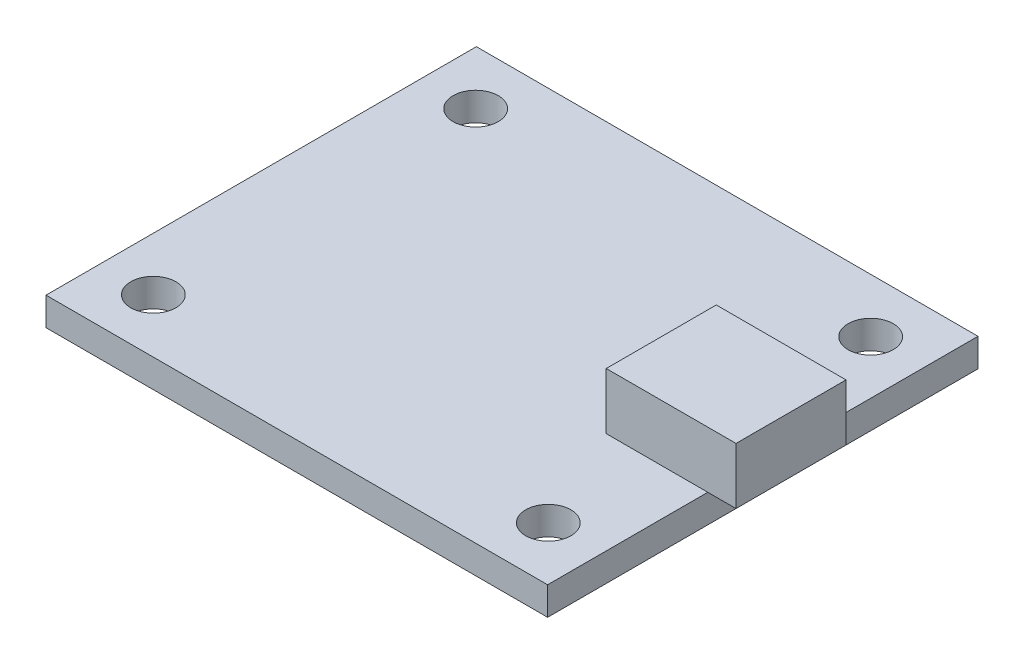
ISO-10303-21;
HEADER;
FILE_DESCRIPTION(('STEP AP214'),'2;1');
FILE_NAME('part.step','',(''),(''),'','','');
FILE_SCHEMA(('AUTOMOTIVE_DESIGN { 1 0 10303 214 1 1 1 1 }'));
ENDSEC;
DATA;
#1=APPLICATION_CONTEXT('core data for automotive mechanical design processes');
#2=APPLICATION_PROTOCOL_DEFINITION('international standard','automotive_design',2000,#1);
#3=PRODUCT_CONTEXT('',#1,'mechanical');
#4=PRODUCT('Part','Part','',(#3));
#5=PRODUCT_RELATED_PRODUCT_CATEGORY('part','',(#4));
#6=PRODUCT_DEFINITION_FORMATION('','',#4);
#7=PRODUCT_DEFINITION_CONTEXT('part definition',#1,'design');
#8=PRODUCT_DEFINITION('design','',#6,#7);
#9=PRODUCT_DEFINITION_SHAPE('','',#8);
#10=(LENGTH_UNIT() NAMED_UNIT(*) SI_UNIT(.MILLI.,.METRE.));
#11=(NAMED_UNIT(*) PLANE_ANGLE_UNIT() SI_UNIT($,.RADIAN.));
#12=(NAMED_UNIT(*) SI_UNIT($,.STERADIAN.) SOLID_ANGLE_UNIT());
#13=UNCERTAINTY_MEASURE_WITH_UNIT(LENGTH_MEASURE(1.E-05),#10,'distance_accuracy_value','');
#14=(GEOMETRIC_REPRESENTATION_CONTEXT(3) GLOBAL_UNCERTAINTY_ASSIGNED_CONTEXT((#13)) GLOBAL_UNIT_ASSIGNED_CONTEXT((#10,
#11,#12)) REPRESENTATION_CONTEXT('',''));
#15=CARTESIAN_POINT('',(0.,0.,0.));
#16=DIRECTION('',(0.,0.,1.));
#17=DIRECTION('',(1.,0.,0.));
#18=AXIS2_PLACEMENT_3D('',#15,#16,#17);
#19=CARTESIAN_POINT('',(17.78,2.,-15.255));
#20=DIRECTION('',(-1.,0.,0.));
#21=DIRECTION('',(0.,0.,1.));
#22=AXIS2_PLACEMENT_3D('',#19,#20,#21);
#23=PLANE('',#22);
#24=DIRECTION('',(0.,0.,-1.));
#25=VECTOR('',#24,1.);
#26=CARTESIAN_POINT('',(17.78,0.,-15.255));
#27=LINE('',#26,#25);
#28=CARTESIAN_POINT('',(17.78,0.,15.255));
#29=VERTEX_POINT('',#28);
#30=CARTESIAN_POINT('',(17.78,0.,-15.255));
#31=VERTEX_POINT('',#30);
#32=EDGE_CURVE('E158',#29,#31,#27,.T.);
#33=ORIENTED_EDGE('',*,*,#32,.T.);
#34=DIRECTION('',(0.,-1.,0.));
#35=VECTOR('',#34,1.);
#36=CARTESIAN_POINT('',(17.78,2.,-15.255));
#37=LINE('',#36,#35);
#38=CARTESIAN_POINT('',(17.78,2.,-15.255));
#39=VERTEX_POINT('',#38);
#40=EDGE_CURVE('E39',#39,#31,#37,.T.);
#41=ORIENTED_EDGE('',*,*,#40,.F.);
#42=DIRECTION('',(0.,0.,-1.));
#43=VECTOR('',#42,1.);
#44=CARTESIAN_POINT('',(17.78,2.,-15.255));
#45=LINE('',#44,#43);
#46=CARTESIAN_POINT('',(17.78,2.,-3.9));
#47=VERTEX_POINT('',#46);
#48=EDGE_CURVE('E165',#47,#39,#45,.T.);
#49=ORIENTED_EDGE('',*,*,#48,.F.);
#50=CARTESIAN_POINT('',(17.78,2.,3.9));
#51=VERTEX_POINT('',#50);
#52=EDGE_CURVE('E164',#51,#47,#45,.T.);
#53=ORIENTED_EDGE('',*,*,#52,.F.);
#54=CARTESIAN_POINT('',(17.78,2.,15.255));
#55=VERTEX_POINT('',#54);
#56=EDGE_CURVE('E161',#55,#51,#45,.T.);
#57=ORIENTED_EDGE('',*,*,#56,.F.);
#58=DIRECTION('',(0.,-1.,0.));
#59=VECTOR('',#58,1.);
#60=CARTESIAN_POINT('',(17.78,2.,15.255));
#61=LINE('',#60,#59);
#62=EDGE_CURVE('E171',#55,#29,#61,.T.);
#63=ORIENTED_EDGE('',*,*,#62,.T.);
#64=EDGE_LOOP('',(#33,#41,#49,#53,#57,#63));
#65=FACE_BOUND('',#64,.T.);
#66=ADVANCED_FACE('F36',(#65),#23,.F.);
#67=CARTESIAN_POINT('',(-17.78,2.,-15.255));
#68=DIRECTION('',(0.,0.,1.));
#69=DIRECTION('',(1.,0.,0.));
#70=AXIS2_PLACEMENT_3D('',#67,#68,#69);
#71=PLANE('',#70);
#72=DIRECTION('',(-1.,0.,0.));
#73=VECTOR('',#72,1.);
#74=CARTESIAN_POINT('',(-17.78,0.,-15.255));
#75=LINE('',#74,#73);
#76=CARTESIAN_POINT('',(-17.78,0.,-15.255));
#77=VERTEX_POINT('',#76);
#78=EDGE_CURVE('E174',#31,#77,#75,.T.);
#79=ORIENTED_EDGE('',*,*,#78,.T.);
#80=DIRECTION('',(0.,-1.,0.));
#81=VECTOR('',#80,1.);
#82=CARTESIAN_POINT('',(-17.78,2.,-15.255));
#83=LINE('',#82,#81);
#84=CARTESIAN_POINT('',(-17.78,2.,-15.255));
#85=VERTEX_POINT('',#84);
#86=EDGE_CURVE('E184',#85,#77,#83,.T.);
#87=ORIENTED_EDGE('',*,*,#86,.F.);
#88=DIRECTION('',(-1.,0.,0.));
#89=VECTOR('',#88,1.);
#90=CARTESIAN_POINT('',(-17.78,2.,-15.255));
#91=LINE('',#90,#89);
#92=EDGE_CURVE('E163',#39,#85,#91,.T.);
#93=ORIENTED_EDGE('',*,*,#92,.F.);
#94=ORIENTED_EDGE('',*,*,#40,.T.);
#95=EDGE_LOOP('',(#79,#87,#93,#94));
#96=FACE_BOUND('',#95,.T.);
#97=ADVANCED_FACE('F194',(#96),#71,.F.);
#98=CARTESIAN_POINT('',(-17.78,2.,-15.255));
#99=DIRECTION('',(1.,0.,0.));
#100=DIRECTION('',(0.,0.,-1.));
#101=AXIS2_PLACEMENT_3D('',#98,#99,#100);
#102=PLANE('',#101);
#103=DIRECTION('',(0.,0.,1.));
#104=VECTOR('',#103,1.);
#105=CARTESIAN_POINT('',(-17.78,0.,-15.255));
#106=LINE('',#105,#104);
#107=CARTESIAN_POINT('',(-17.78,0.,15.255));
#108=VERTEX_POINT('',#107);
#109=EDGE_CURVE('E176',#77,#108,#106,.T.);
#110=ORIENTED_EDGE('',*,*,#109,.T.);
#111=DIRECTION('',(0.,-1.,0.));
#112=VECTOR('',#111,1.);
#113=CARTESIAN_POINT('',(-17.78,2.,15.255));
#114=LINE('',#113,#112);
#115=CARTESIAN_POINT('',(-17.78,2.,15.255));
#116=VERTEX_POINT('',#115);
#117=EDGE_CURVE('E182',#116,#108,#114,.T.);
#118=ORIENTED_EDGE('',*,*,#117,.F.);
#119=DIRECTION('',(0.,0.,1.));
#120=VECTOR('',#119,1.);
#121=CARTESIAN_POINT('',(-17.78,2.,-15.255));
#122=LINE('',#121,#120);
#123=EDGE_CURVE('E167',#85,#116,#122,.T.);
#124=ORIENTED_EDGE('',*,*,#123,.F.);
#125=ORIENTED_EDGE('',*,*,#86,.T.);
#126=EDGE_LOOP('',(#110,#118,#124,#125));
#127=FACE_BOUND('',#126,.T.);
#128=ADVANCED_FACE('F203',(#127),#102,.F.);
#129=CARTESIAN_POINT('',(-17.78,2.,15.255));
#130=DIRECTION('',(0.,0.,-1.));
#131=DIRECTION('',(-1.,0.,0.));
#132=AXIS2_PLACEMENT_3D('',#129,#130,#131);
#133=PLANE('',#132);
#134=DIRECTION('',(1.,0.,0.));
#135=VECTOR('',#134,1.);
#136=CARTESIAN_POINT('',(-17.78,0.,15.255));
#137=LINE('',#136,#135);
#138=EDGE_CURVE('E178',#108,#29,#137,.T.);
#139=ORIENTED_EDGE('',*,*,#138,.T.);
#140=ORIENTED_EDGE('',*,*,#62,.F.);
#141=DIRECTION('',(1.,0.,0.));
#142=VECTOR('',#141,1.);
#143=CARTESIAN_POINT('',(-17.78,2.,15.255));
#144=LINE('',#143,#142);
#145=EDGE_CURVE('E169',#116,#55,#144,.T.);
#146=ORIENTED_EDGE('',*,*,#145,.F.);
#147=ORIENTED_EDGE('',*,*,#117,.T.);
#148=EDGE_LOOP('',(#139,#140,#146,#147));
#149=FACE_BOUND('',#148,.T.);
#150=ADVANCED_FACE('F206',(#149),#133,.F.);
#151=CARTESIAN_POINT('',(0.,2.,0.));
#152=DIRECTION('',(0.,1.,0.));
#153=DIRECTION('',(0.,0.,1.));
#154=AXIS2_PLACEMENT_3D('',#151,#152,#153);
#155=PLANE('',#154);
#156=DIRECTION('',(1.,0.,0.));
#157=VECTOR('',#156,1.);
#158=CARTESIAN_POINT('',(10.58,2.,3.9));
#159=LINE('',#158,#157);
#160=CARTESIAN_POINT('',(10.58,2.,3.9));
#161=VERTEX_POINT('',#160);
#162=EDGE_CURVE('E52',#161,#51,#159,.T.);
#163=ORIENTED_EDGE('',*,*,#162,.F.);
#164=DIRECTION('',(0.,0.,1.));
#165=VECTOR('',#164,1.);
#166=CARTESIAN_POINT('',(10.58,2.,-3.9));
#167=LINE('',#166,#165);
#168=CARTESIAN_POINT('',(10.58,2.,-3.9));
#169=VERTEX_POINT('',#168);
#170=EDGE_CURVE('E214',#169,#161,#167,.T.);
#171=ORIENTED_EDGE('',*,*,#170,.F.);
#172=DIRECTION('',(-1.,0.,0.));
#173=VECTOR('',#172,1.);
#174=CARTESIAN_POINT('',(10.58,2.,-3.9));
#175=LINE('',#174,#173);
#176=EDGE_CURVE('E11',#47,#169,#175,.T.);
#177=ORIENTED_EDGE('',*,*,#176,.F.);
#178=ORIENTED_EDGE('',*,*,#48,.T.);
#179=ORIENTED_EDGE('',*,*,#92,.T.);
#180=ORIENTED_EDGE('',*,*,#123,.T.);
#181=ORIENTED_EDGE('',*,*,#145,.T.);
#182=ORIENTED_EDGE('',*,*,#56,.T.);
#183=EDGE_LOOP('',(#163,#171,#177,#178,#179,#180,#181,#182));
#184=FACE_BOUND('',#183,.T.);
#185=CARTESIAN_POINT('',(-14.,2.,11.425));
#186=DIRECTION('',(0.,1.,0.));
#187=DIRECTION('',(0.,0.,1.));
#188=AXIS2_PLACEMENT_3D('',#185,#186,#187);
#189=CIRCLE('',#188,1.6);
#190=CARTESIAN_POINT('',(-14.,2.,13.025));
#191=VERTEX_POINT('',#190);
#192=EDGE_CURVE('E131',#191,#191,#189,.T.);
#193=ORIENTED_EDGE('',*,*,#192,.F.);
#194=EDGE_LOOP('',(#193));
#195=FACE_BOUND('',#194,.T.);
#196=CARTESIAN_POINT('',(14.,2.,11.425));
#197=DIRECTION('',(0.,1.,0.));
#198=DIRECTION('',(0.,0.,1.));
#199=AXIS2_PLACEMENT_3D('',#196,#197,#198);
#200=CIRCLE('',#199,1.6);
#201=CARTESIAN_POINT('',(14.,2.,13.025));
#202=VERTEX_POINT('',#201);
#203=EDGE_CURVE('E150',#202,#202,#200,.T.);
#204=ORIENTED_EDGE('',*,*,#203,.F.);
#205=EDGE_LOOP('',(#204));
#206=FACE_BOUND('',#205,.T.);
#207=CARTESIAN_POINT('',(14.,2.,-11.425));
#208=DIRECTION('',(0.,1.,0.));
#209=DIRECTION('',(0.,0.,1.));
#210=AXIS2_PLACEMENT_3D('',#207,#208,#209);
#211=CIRCLE('',#210,1.6);
#212=CARTESIAN_POINT('',(14.,2.,-9.825));
#213=VERTEX_POINT('',#212);
#214=EDGE_CURVE('E144',#213,#213,#211,.T.);
#215=ORIENTED_EDGE('',*,*,#214,.F.);
#216=EDGE_LOOP('',(#215));
#217=FACE_BOUND('',#216,.T.);
#218=CARTESIAN_POINT('',(-14.,2.,-11.425));
#219=DIRECTION('',(0.,1.,0.));
#220=DIRECTION('',(0.,0.,1.));
#221=AXIS2_PLACEMENT_3D('',#218,#219,#220);
#222=CIRCLE('',#221,1.6);
#223=CARTESIAN_POINT('',(-14.,2.,-9.825));
#224=VERTEX_POINT('',#223);
#225=EDGE_CURVE('E143',#224,#224,#222,.T.);
#226=ORIENTED_EDGE('',*,*,#225,.F.);
#227=EDGE_LOOP('',(#226));
#228=FACE_BOUND('',#227,.T.);
#229=ADVANCED_FACE('F207',(#184,#195,#206,#217,#228),#155,.T.);
#230=CARTESIAN_POINT('',(0.,0.,0.));
#231=DIRECTION('',(0.,1.,0.));
#232=DIRECTION('',(0.,0.,1.));
#233=AXIS2_PLACEMENT_3D('',#230,#231,#232);
#234=PLANE('',#233);
#235=CARTESIAN_POINT('',(-14.,0.,11.425));
#236=DIRECTION('',(0.,1.,0.));
#237=DIRECTION('',(0.,0.,1.));
#238=AXIS2_PLACEMENT_3D('',#235,#236,#237);
#239=CIRCLE('',#238,1.6);
#240=CARTESIAN_POINT('',(-14.,0.,13.025));
#241=VERTEX_POINT('',#240);
#242=EDGE_CURVE('E134',#241,#241,#239,.T.);
#243=ORIENTED_EDGE('',*,*,#242,.T.);
#244=EDGE_LOOP('',(#243));
#245=FACE_BOUND('',#244,.T.);
#246=CARTESIAN_POINT('',(14.,0.,11.425));
#247=DIRECTION('',(0.,1.,0.));
#248=DIRECTION('',(0.,0.,1.));
#249=AXIS2_PLACEMENT_3D('',#246,#247,#248);
#250=CIRCLE('',#249,1.6);
#251=CARTESIAN_POINT('',(14.,0.,13.025));
#252=VERTEX_POINT('',#251);
#253=EDGE_CURVE('E147',#252,#252,#250,.T.);
#254=ORIENTED_EDGE('',*,*,#253,.T.);
#255=EDGE_LOOP('',(#254));
#256=FACE_BOUND('',#255,.T.);
#257=CARTESIAN_POINT('',(14.,0.,-11.425));
#258=DIRECTION('',(0.,1.,0.));
#259=DIRECTION('',(0.,0.,1.));
#260=AXIS2_PLACEMENT_3D('',#257,#258,#259);
#261=CIRCLE('',#260,1.6);
#262=CARTESIAN_POINT('',(14.,0.,-9.825));
#263=VERTEX_POINT('',#262);
#264=EDGE_CURVE('E140',#263,#263,#261,.T.);
#265=ORIENTED_EDGE('',*,*,#264,.T.);
#266=EDGE_LOOP('',(#265));
#267=FACE_BOUND('',#266,.T.);
#268=CARTESIAN_POINT('',(-14.,0.,-11.425));
#269=DIRECTION('',(0.,1.,0.));
#270=DIRECTION('',(0.,0.,1.));
#271=AXIS2_PLACEMENT_3D('',#268,#269,#270);
#272=CIRCLE('',#271,1.6);
#273=CARTESIAN_POINT('',(-14.,0.,-9.825));
#274=VERTEX_POINT('',#273);
#275=EDGE_CURVE('E155',#274,#274,#272,.T.);
#276=ORIENTED_EDGE('',*,*,#275,.T.);
#277=EDGE_LOOP('',(#276));
#278=FACE_BOUND('',#277,.T.);
#279=ORIENTED_EDGE('',*,*,#32,.F.);
#280=ORIENTED_EDGE('',*,*,#138,.F.);
#281=ORIENTED_EDGE('',*,*,#109,.F.);
#282=ORIENTED_EDGE('',*,*,#78,.F.);
#283=EDGE_LOOP('',(#279,#280,#281,#282));
#284=FACE_BOUND('',#283,.T.);
#285=ADVANCED_FACE('F201',(#245,#256,#267,#278,#284),#234,.F.);
#286=CARTESIAN_POINT('',(-14.,0.,-11.425));
#287=DIRECTION('',(0.,1.,0.));
#288=DIRECTION('',(0.,0.,1.));
#289=AXIS2_PLACEMENT_3D('',#286,#287,#288);
#290=CYLINDRICAL_SURFACE('',#289,1.6);
#291=ORIENTED_EDGE('',*,*,#275,.F.);
#292=EDGE_LOOP('',(#291));
#293=FACE_BOUND('',#292,.T.);
#294=ORIENTED_EDGE('',*,*,#225,.T.);
#295=EDGE_LOOP('',(#294));
#296=FACE_BOUND('',#295,.T.);
#297=ADVANCED_FACE('F249',(#293,#296),#290,.F.);
#298=CARTESIAN_POINT('',(14.,0.,-11.425));
#299=DIRECTION('',(0.,1.,0.));
#300=DIRECTION('',(0.,0.,1.));
#301=AXIS2_PLACEMENT_3D('',#298,#299,#300);
#302=CYLINDRICAL_SURFACE('',#301,1.6);
#303=ORIENTED_EDGE('',*,*,#264,.F.);
#304=EDGE_LOOP('',(#303));
#305=FACE_BOUND('',#304,.T.);
#306=ORIENTED_EDGE('',*,*,#214,.T.);
#307=EDGE_LOOP('',(#306));
#308=FACE_BOUND('',#307,.T.);
#309=ADVANCED_FACE('F255',(#305,#308),#302,.F.);
#310=CARTESIAN_POINT('',(14.,0.,11.425));
#311=DIRECTION('',(0.,1.,0.));
#312=DIRECTION('',(0.,0.,1.));
#313=AXIS2_PLACEMENT_3D('',#310,#311,#312);
#314=CYLINDRICAL_SURFACE('',#313,1.6);
#315=ORIENTED_EDGE('',*,*,#253,.F.);
#316=EDGE_LOOP('',(#315));
#317=FACE_BOUND('',#316,.T.);
#318=ORIENTED_EDGE('',*,*,#203,.T.);
#319=EDGE_LOOP('',(#318));
#320=FACE_BOUND('',#319,.T.);
#321=ADVANCED_FACE('F260',(#317,#320),#314,.F.);
#322=CARTESIAN_POINT('',(-14.,0.,11.425));
#323=DIRECTION('',(0.,1.,0.));
#324=DIRECTION('',(0.,0.,1.));
#325=AXIS2_PLACEMENT_3D('',#322,#323,#324);
#326=CYLINDRICAL_SURFACE('',#325,1.6);
#327=ORIENTED_EDGE('',*,*,#242,.F.);
#328=EDGE_LOOP('',(#327));
#329=FACE_BOUND('',#328,.T.);
#330=ORIENTED_EDGE('',*,*,#192,.T.);
#331=EDGE_LOOP('',(#330));
#332=FACE_BOUND('',#331,.T.);
#333=ADVANCED_FACE('F257',(#329,#332),#326,.F.);
#334=CARTESIAN_POINT('',(0.,2.,0.));
#335=DIRECTION('',(0.,1.,0.));
#336=DIRECTION('',(0.,0.,1.));
#337=AXIS2_PLACEMENT_3D('',#334,#335,#336);
#338=PLANE('',#337);
#339=CARTESIAN_POINT('',(19.78,2.,3.9));
#340=VERTEX_POINT('',#339);
#341=EDGE_CURVE('E213',#51,#340,#159,.T.);
#342=ORIENTED_EDGE('',*,*,#341,.F.);
#343=ORIENTED_EDGE('',*,*,#52,.T.);
#344=CARTESIAN_POINT('',(19.78,2.,-3.9));
#345=VERTEX_POINT('',#344);
#346=EDGE_CURVE('E45',#345,#47,#175,.T.);
#347=ORIENTED_EDGE('',*,*,#346,.F.);
#348=DIRECTION('',(0.,0.,-1.));
#349=VECTOR('',#348,1.);
#350=CARTESIAN_POINT('',(19.78,2.,-3.9));
#351=LINE('',#350,#349);
#352=EDGE_CURVE('E130',#340,#345,#351,.T.);
#353=ORIENTED_EDGE('',*,*,#352,.F.);
#354=EDGE_LOOP('',(#342,#343,#347,#353));
#355=FACE_BOUND('',#354,.T.);
#356=ADVANCED_FACE('F212',(#355),#338,.F.);
#357=CARTESIAN_POINT('',(19.78,6.,-3.9));
#358=DIRECTION('',(-1.,0.,0.));
#359=DIRECTION('',(0.,0.,1.));
#360=AXIS2_PLACEMENT_3D('',#357,#358,#359);
#361=PLANE('',#360);
#362=ORIENTED_EDGE('',*,*,#352,.T.);
#363=DIRECTION('',(0.,-1.,0.));
#364=VECTOR('',#363,1.);
#365=CARTESIAN_POINT('',(19.78,6.,-3.9));
#366=LINE('',#365,#364);
#367=CARTESIAN_POINT('',(19.78,6.,-3.9));
#368=VERTEX_POINT('',#367);
#369=EDGE_CURVE('E111',#368,#345,#366,.T.);
#370=ORIENTED_EDGE('',*,*,#369,.F.);
#371=DIRECTION('',(0.,0.,-1.));
#372=VECTOR('',#371,1.);
#373=CARTESIAN_POINT('',(19.78,6.,-3.9));
#374=LINE('',#373,#372);
#375=CARTESIAN_POINT('',(19.78,6.,3.9));
#376=VERTEX_POINT('',#375);
#377=EDGE_CURVE('E118',#376,#368,#374,.T.);
#378=ORIENTED_EDGE('',*,*,#377,.F.);
#379=DIRECTION('',(0.,-1.,0.));
#380=VECTOR('',#379,1.);
#381=CARTESIAN_POINT('',(19.78,6.,3.9));
#382=LINE('',#381,#380);
#383=EDGE_CURVE('E220',#376,#340,#382,.T.);
#384=ORIENTED_EDGE('',*,*,#383,.T.);
#385=EDGE_LOOP('',(#362,#370,#378,#384));
#386=FACE_BOUND('',#385,.T.);
#387=ADVANCED_FACE('F128',(#386),#361,.F.);
#388=CARTESIAN_POINT('',(10.58,6.,-3.9));
#389=DIRECTION('',(0.,0.,1.));
#390=DIRECTION('',(1.,0.,0.));
#391=AXIS2_PLACEMENT_3D('',#388,#389,#390);
#392=PLANE('',#391);
#393=ORIENTED_EDGE('',*,*,#346,.T.);
#394=ORIENTED_EDGE('',*,*,#176,.T.);
#395=DIRECTION('',(0.,-1.,0.));
#396=VECTOR('',#395,1.);
#397=CARTESIAN_POINT('',(10.58,6.,-3.9));
#398=LINE('',#397,#396);
#399=CARTESIAN_POINT('',(10.58,6.,-3.9));
#400=VERTEX_POINT('',#399);
#401=EDGE_CURVE('E114',#400,#169,#398,.T.);
#402=ORIENTED_EDGE('',*,*,#401,.F.);
#403=DIRECTION('',(-1.,0.,0.));
#404=VECTOR('',#403,1.);
#405=CARTESIAN_POINT('',(10.58,6.,-3.9));
#406=LINE('',#405,#404);
#407=EDGE_CURVE('E106',#368,#400,#406,.T.);
#408=ORIENTED_EDGE('',*,*,#407,.F.);
#409=ORIENTED_EDGE('',*,*,#369,.T.);
#410=EDGE_LOOP('',(#393,#394,#402,#408,#409));
#411=FACE_BOUND('',#410,.T.);
#412=ADVANCED_FACE('F109',(#411),#392,.F.);
#413=CARTESIAN_POINT('',(10.58,6.,-3.9));
#414=DIRECTION('',(1.,0.,0.));
#415=DIRECTION('',(0.,0.,-1.));
#416=AXIS2_PLACEMENT_3D('',#413,#414,#415);
#417=PLANE('',#416);
#418=ORIENTED_EDGE('',*,*,#170,.T.);
#419=DIRECTION('',(0.,-1.,0.));
#420=VECTOR('',#419,1.);
#421=CARTESIAN_POINT('',(10.58,6.,3.9));
#422=LINE('',#421,#420);
#423=CARTESIAN_POINT('',(10.58,6.,3.9));
#424=VERTEX_POINT('',#423);
#425=EDGE_CURVE('E136',#424,#161,#422,.T.);
#426=ORIENTED_EDGE('',*,*,#425,.F.);
#427=DIRECTION('',(0.,0.,1.));
#428=VECTOR('',#427,1.);
#429=CARTESIAN_POINT('',(10.58,6.,-3.9));
#430=LINE('',#429,#428);
#431=EDGE_CURVE('E117',#400,#424,#430,.T.);
#432=ORIENTED_EDGE('',*,*,#431,.F.);
#433=ORIENTED_EDGE('',*,*,#401,.T.);
#434=EDGE_LOOP('',(#418,#426,#432,#433));
#435=FACE_BOUND('',#434,.T.);
#436=ADVANCED_FACE('F226',(#435),#417,.F.);
#437=CARTESIAN_POINT('',(10.58,6.,3.9));
#438=DIRECTION('',(0.,0.,-1.));
#439=DIRECTION('',(-1.,0.,0.));
#440=AXIS2_PLACEMENT_3D('',#437,#438,#439);
#441=PLANE('',#440);
#442=ORIENTED_EDGE('',*,*,#162,.T.);
#443=ORIENTED_EDGE('',*,*,#341,.T.);
#444=ORIENTED_EDGE('',*,*,#383,.F.);
#445=DIRECTION('',(1.,0.,0.));
#446=VECTOR('',#445,1.);
#447=CARTESIAN_POINT('',(10.58,6.,3.9));
#448=LINE('',#447,#446);
#449=EDGE_CURVE('E123',#424,#376,#448,.T.);
#450=ORIENTED_EDGE('',*,*,#449,.F.);
#451=ORIENTED_EDGE('',*,*,#425,.T.);
#452=EDGE_LOOP('',(#442,#443,#444,#450,#451));
#453=FACE_BOUND('',#452,.T.);
#454=ADVANCED_FACE('F224',(#453),#441,.F.);
#455=CARTESIAN_POINT('',(0.,6.,0.));
#456=DIRECTION('',(0.,1.,0.));
#457=DIRECTION('',(0.,0.,1.));
#458=AXIS2_PLACEMENT_3D('',#455,#456,#457);
#459=PLANE('',#458);
#460=ORIENTED_EDGE('',*,*,#377,.T.);
#461=ORIENTED_EDGE('',*,*,#407,.T.);
#462=ORIENTED_EDGE('',*,*,#431,.T.);
#463=ORIENTED_EDGE('',*,*,#449,.T.);
#464=EDGE_LOOP('',(#460,#461,#462,#463));
#465=FACE_BOUND('',#464,.T.);
#466=ADVANCED_FACE('F121',(#465),#459,.T.);
#467=CLOSED_SHELL('',(#66,#97,#128,#150,#229,#285,#297,#309,#321,#333,#356,#387,#412,#436,#454,#466));
#468=MANIFOLD_SOLID_BREP('B2',#467);
#469=ADVANCED_BREP_SHAPE_REPRESENTATION('',(#18,#468),#14);
#470=SHAPE_DEFINITION_REPRESENTATION(#9,#469);
ENDSEC;
END-ISO-10303-21;
